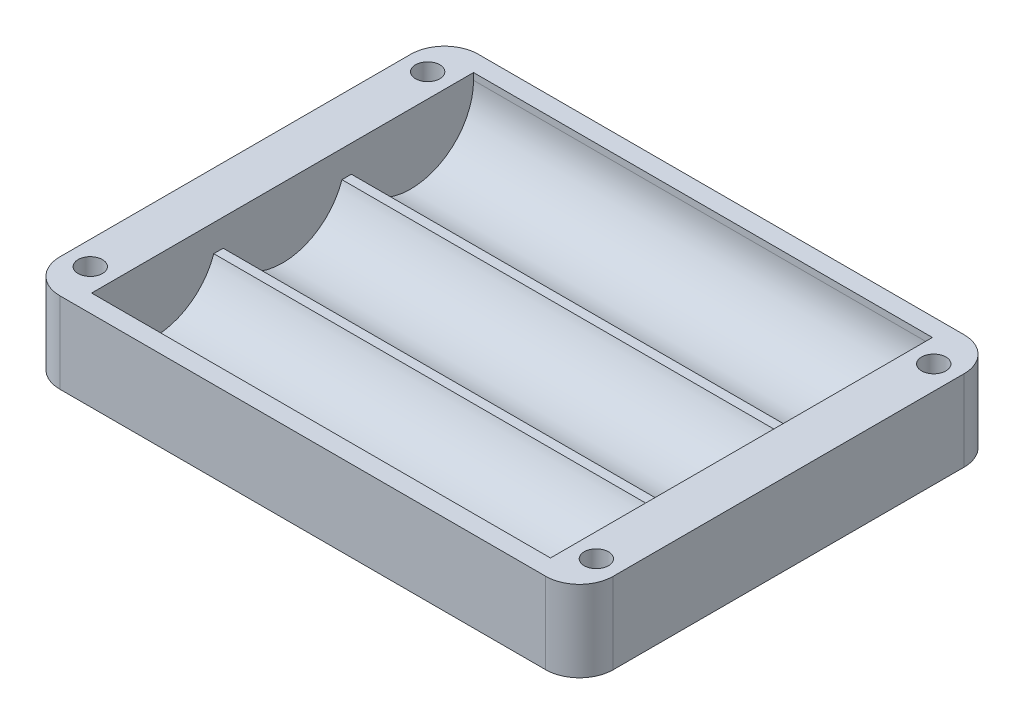
ISO-10303-21;
HEADER;
FILE_DESCRIPTION(('STEP AP214'),'2;1');
FILE_NAME('part.step','',(''),(''),'','','');
FILE_SCHEMA(('AUTOMOTIVE_DESIGN { 1 0 10303 214 1 1 1 1 }'));
ENDSEC;
DATA;
#1=APPLICATION_CONTEXT('core data for automotive mechanical design processes');
#2=APPLICATION_PROTOCOL_DEFINITION('international standard','automotive_design',2000,#1);
#3=PRODUCT_CONTEXT('',#1,'mechanical');
#4=PRODUCT('Part','Part','',(#3));
#5=PRODUCT_RELATED_PRODUCT_CATEGORY('part','',(#4));
#6=PRODUCT_DEFINITION_FORMATION('','',#4);
#7=PRODUCT_DEFINITION_CONTEXT('part definition',#1,'design');
#8=PRODUCT_DEFINITION('design','',#6,#7);
#9=PRODUCT_DEFINITION_SHAPE('','',#8);
#10=(LENGTH_UNIT() NAMED_UNIT(*) SI_UNIT(.MILLI.,.METRE.));
#11=(NAMED_UNIT(*) PLANE_ANGLE_UNIT() SI_UNIT($,.RADIAN.));
#12=(NAMED_UNIT(*) SI_UNIT($,.STERADIAN.) SOLID_ANGLE_UNIT());
#13=UNCERTAINTY_MEASURE_WITH_UNIT(LENGTH_MEASURE(1.E-05),#10,'distance_accuracy_value','');
#14=(GEOMETRIC_REPRESENTATION_CONTEXT(3) GLOBAL_UNCERTAINTY_ASSIGNED_CONTEXT((#13)) GLOBAL_UNIT_ASSIGNED_CONTEXT((#10,
#11,#12)) REPRESENTATION_CONTEXT('',''));
#15=CARTESIAN_POINT('',(0.,0.,0.));
#16=DIRECTION('',(0.,0.,1.));
#17=DIRECTION('',(1.,0.,0.));
#18=AXIS2_PLACEMENT_3D('',#15,#16,#17);
#19=CARTESIAN_POINT('',(36.,12.,26.));
#20=DIRECTION('',(0.,1.,0.));
#21=DIRECTION('',(0.,0.,1.));
#22=AXIS2_PLACEMENT_3D('',#19,#20,#21);
#23=PLANE('',#22);
#24=CARTESIAN_POINT('',(-37.5,12.,-25.));
#25=DIRECTION('',(0.,1.,0.));
#26=DIRECTION('',(0.,0.,1.));
#27=AXIS2_PLACEMENT_3D('',#24,#25,#26);
#28=CIRCLE('',#27,1.8);
#29=CARTESIAN_POINT('',(-37.5,12.,-23.2));
#30=VERTEX_POINT('',#29);
#31=EDGE_CURVE('E517',#30,#30,#28,.T.);
#32=ORIENTED_EDGE('',*,*,#31,.F.);
#33=EDGE_LOOP('',(#32));
#34=FACE_BOUND('',#33,.T.);
#35=CARTESIAN_POINT('',(-37.5,12.,25.));
#36=DIRECTION('',(0.,1.,0.));
#37=DIRECTION('',(0.,0.,1.));
#38=AXIS2_PLACEMENT_3D('',#35,#36,#37);
#39=CIRCLE('',#38,1.8);
#40=CARTESIAN_POINT('',(-37.5,12.,26.8));
#41=VERTEX_POINT('',#40);
#42=EDGE_CURVE('E519',#41,#41,#39,.T.);
#43=ORIENTED_EDGE('',*,*,#42,.F.);
#44=EDGE_LOOP('',(#43));
#45=FACE_BOUND('',#44,.T.);
#46=CARTESIAN_POINT('',(37.5,12.,25.));
#47=DIRECTION('',(0.,1.,0.));
#48=DIRECTION('',(0.,0.,1.));
#49=AXIS2_PLACEMENT_3D('',#46,#47,#48);
#50=CIRCLE('',#49,1.8);
#51=CARTESIAN_POINT('',(37.5,12.,26.8));
#52=VERTEX_POINT('',#51);
#53=EDGE_CURVE('E527',#52,#52,#50,.T.);
#54=ORIENTED_EDGE('',*,*,#53,.F.);
#55=EDGE_LOOP('',(#54));
#56=FACE_BOUND('',#55,.T.);
#57=CARTESIAN_POINT('',(37.5,12.,-25.));
#58=DIRECTION('',(0.,1.,0.));
#59=DIRECTION('',(0.,0.,1.));
#60=AXIS2_PLACEMENT_3D('',#57,#58,#59);
#61=CIRCLE('',#60,1.8);
#62=CARTESIAN_POINT('',(37.5,12.,-23.2));
#63=VERTEX_POINT('',#62);
#64=EDGE_CURVE('E533',#63,#63,#61,.T.);
#65=ORIENTED_EDGE('',*,*,#64,.F.);
#66=EDGE_LOOP('',(#65));
#67=FACE_BOUND('',#66,.T.);
#68=CARTESIAN_POINT('',(36.,12.,26.));
#69=DIRECTION('',(0.,1.,0.));
#70=DIRECTION('',(0.,0.,1.));
#71=AXIS2_PLACEMENT_3D('',#68,#69,#70);
#72=CIRCLE('',#71,5.);
#73=CARTESIAN_POINT('',(36.,12.,31.));
#74=VERTEX_POINT('',#73);
#75=CARTESIAN_POINT('',(41.,12.,26.));
#76=VERTEX_POINT('',#75);
#77=EDGE_CURVE('E158',#74,#76,#72,.T.);
#78=ORIENTED_EDGE('',*,*,#77,.T.);
#79=DIRECTION('',(0.,0.,-1.));
#80=VECTOR('',#79,1.);
#81=CARTESIAN_POINT('',(41.,12.,-26.));
#82=LINE('',#81,#80);
#83=CARTESIAN_POINT('',(41.,12.,-26.));
#84=VERTEX_POINT('',#83);
#85=EDGE_CURVE('E99',#76,#84,#82,.T.);
#86=ORIENTED_EDGE('',*,*,#85,.T.);
#87=CARTESIAN_POINT('',(36.,12.,-26.));
#88=DIRECTION('',(0.,1.,0.));
#89=DIRECTION('',(0.,0.,-1.));
#90=AXIS2_PLACEMENT_3D('',#87,#88,#89);
#91=CIRCLE('',#90,5.);
#92=CARTESIAN_POINT('',(36.,12.,-31.));
#93=VERTEX_POINT('',#92);
#94=EDGE_CURVE('E243',#84,#93,#91,.T.);
#95=ORIENTED_EDGE('',*,*,#94,.T.);
#96=DIRECTION('',(-1.,0.,0.));
#97=VECTOR('',#96,1.);
#98=CARTESIAN_POINT('',(-36.,12.,-31.));
#99=LINE('',#98,#97);
#100=CARTESIAN_POINT('',(-36.,12.,-31.));
#101=VERTEX_POINT('',#100);
#102=EDGE_CURVE('E245',#93,#101,#99,.T.);
#103=ORIENTED_EDGE('',*,*,#102,.T.);
#104=CARTESIAN_POINT('',(-36.,12.,-26.));
#105=DIRECTION('',(0.,1.,0.));
#106=DIRECTION('',(0.,0.,1.));
#107=AXIS2_PLACEMENT_3D('',#104,#105,#106);
#108=CIRCLE('',#107,5.);
#109=CARTESIAN_POINT('',(-41.,12.,-26.));
#110=VERTEX_POINT('',#109);
#111=EDGE_CURVE('E121',#101,#110,#108,.T.);
#112=ORIENTED_EDGE('',*,*,#111,.T.);
#113=DIRECTION('',(0.,0.,1.));
#114=VECTOR('',#113,1.);
#115=CARTESIAN_POINT('',(-41.,12.,-26.));
#116=LINE('',#115,#114);
#117=CARTESIAN_POINT('',(-41.,12.,26.));
#118=VERTEX_POINT('',#117);
#119=EDGE_CURVE('E114',#110,#118,#116,.T.);
#120=ORIENTED_EDGE('',*,*,#119,.T.);
#121=CARTESIAN_POINT('',(-36.,12.,26.));
#122=DIRECTION('',(0.,1.,0.));
#123=DIRECTION('',(0.,0.,1.));
#124=AXIS2_PLACEMENT_3D('',#121,#122,#123);
#125=CIRCLE('',#124,5.);
#126=CARTESIAN_POINT('',(-36.,12.,31.));
#127=VERTEX_POINT('',#126);
#128=EDGE_CURVE('E118',#118,#127,#125,.T.);
#129=ORIENTED_EDGE('',*,*,#128,.T.);
#130=DIRECTION('',(1.,0.,0.));
#131=VECTOR('',#130,1.);
#132=CARTESIAN_POINT('',(-36.,12.,31.));
#133=LINE('',#132,#131);
#134=EDGE_CURVE('E57',#127,#74,#133,.T.);
#135=ORIENTED_EDGE('',*,*,#134,.T.);
#136=EDGE_LOOP('',(#78,#86,#95,#103,#112,#120,#129,#135));
#137=FACE_BOUND('',#136,.T.);
#138=DIRECTION('',(1.,0.,0.));
#139=VECTOR('',#138,1.);
#140=CARTESIAN_POINT('',(36.,12.,28.3));
#141=LINE('',#140,#139);
#142=CARTESIAN_POINT('',(-34.,12.,28.3));
#143=VERTEX_POINT('',#142);
#144=CARTESIAN_POINT('',(34.,12.,28.3));
#145=VERTEX_POINT('',#144);
#146=EDGE_CURVE('E41',#143,#145,#141,.T.);
#147=ORIENTED_EDGE('',*,*,#146,.F.);
#148=DIRECTION('',(0.,0.,-1.));
#149=VECTOR('',#148,1.);
#150=CARTESIAN_POINT('',(-34.,12.,26.));
#151=LINE('',#150,#149);
#152=CARTESIAN_POINT('',(-34.,12.,-28.3));
#153=VERTEX_POINT('',#152);
#154=EDGE_CURVE('E11',#143,#153,#151,.T.);
#155=ORIENTED_EDGE('',*,*,#154,.T.);
#156=DIRECTION('',(-1.,0.,0.));
#157=VECTOR('',#156,1.);
#158=CARTESIAN_POINT('',(36.,12.,-28.3));
#159=LINE('',#158,#157);
#160=CARTESIAN_POINT('',(34.,12.,-28.3));
#161=VERTEX_POINT('',#160);
#162=EDGE_CURVE('E175',#161,#153,#159,.T.);
#163=ORIENTED_EDGE('',*,*,#162,.F.);
#164=DIRECTION('',(0.,0.,-1.));
#165=VECTOR('',#164,1.);
#166=CARTESIAN_POINT('',(34.,12.,26.));
#167=LINE('',#166,#165);
#168=EDGE_CURVE('E173',#145,#161,#167,.T.);
#169=ORIENTED_EDGE('',*,*,#168,.F.);
#170=EDGE_LOOP('',(#147,#155,#163,#169));
#171=FACE_BOUND('',#170,.T.);
#172=ADVANCED_FACE('F33',(#34,#45,#56,#67,#137,#171),#23,.T.);
#173=CARTESIAN_POINT('',(36.,12.,26.));
#174=DIRECTION('',(0.,-1.,0.));
#175=DIRECTION('',(0.,0.,-1.));
#176=AXIS2_PLACEMENT_3D('',#173,#174,#175);
#177=CYLINDRICAL_SURFACE('',#176,5.);
#178=CARTESIAN_POINT('',(36.,0.,26.));
#179=DIRECTION('',(0.,1.,0.));
#180=DIRECTION('',(0.,0.,1.));
#181=AXIS2_PLACEMENT_3D('',#178,#179,#180);
#182=CIRCLE('',#181,5.);
#183=CARTESIAN_POINT('',(36.,0.,31.));
#184=VERTEX_POINT('',#183);
#185=CARTESIAN_POINT('',(41.,0.,26.));
#186=VERTEX_POINT('',#185);
#187=EDGE_CURVE('E142',#184,#186,#182,.T.);
#188=ORIENTED_EDGE('',*,*,#187,.T.);
#189=DIRECTION('',(0.,-1.,0.));
#190=VECTOR('',#189,1.);
#191=CARTESIAN_POINT('',(41.,12.,26.));
#192=LINE('',#191,#190);
#193=EDGE_CURVE('E171',#76,#186,#192,.T.);
#194=ORIENTED_EDGE('',*,*,#193,.F.);
#195=ORIENTED_EDGE('',*,*,#77,.F.);
#196=DIRECTION('',(0.,-1.,0.));
#197=VECTOR('',#196,1.);
#198=CARTESIAN_POINT('',(36.,12.,31.));
#199=LINE('',#198,#197);
#200=EDGE_CURVE('E138',#74,#184,#199,.T.);
#201=ORIENTED_EDGE('',*,*,#200,.T.);
#202=EDGE_LOOP('',(#188,#194,#195,#201));
#203=FACE_BOUND('',#202,.T.);
#204=ADVANCED_FACE('F35',(#203),#177,.T.);
#205=CARTESIAN_POINT('',(41.,12.,-26.));
#206=DIRECTION('',(-1.,0.,0.));
#207=DIRECTION('',(0.,0.,1.));
#208=AXIS2_PLACEMENT_3D('',#205,#206,#207);
#209=PLANE('',#208);
#210=DIRECTION('',(0.,0.,-1.));
#211=VECTOR('',#210,1.);
#212=CARTESIAN_POINT('',(41.,0.,-26.));
#213=LINE('',#212,#211);
#214=CARTESIAN_POINT('',(41.,0.,-26.));
#215=VERTEX_POINT('',#214);
#216=EDGE_CURVE('E145',#186,#215,#213,.T.);
#217=ORIENTED_EDGE('',*,*,#216,.T.);
#218=DIRECTION('',(0.,-1.,0.));
#219=VECTOR('',#218,1.);
#220=CARTESIAN_POINT('',(41.,12.,-26.));
#221=LINE('',#220,#219);
#222=EDGE_CURVE('E168',#84,#215,#221,.T.);
#223=ORIENTED_EDGE('',*,*,#222,.F.);
#224=ORIENTED_EDGE('',*,*,#85,.F.);
#225=ORIENTED_EDGE('',*,*,#193,.T.);
#226=EDGE_LOOP('',(#217,#223,#224,#225));
#227=FACE_BOUND('',#226,.T.);
#228=ADVANCED_FACE('F263',(#227),#209,.F.);
#229=CARTESIAN_POINT('',(36.,12.,-26.));
#230=DIRECTION('',(0.,-1.,0.));
#231=DIRECTION('',(0.,0.,-1.));
#232=AXIS2_PLACEMENT_3D('',#229,#230,#231);
#233=CYLINDRICAL_SURFACE('',#232,5.);
#234=CARTESIAN_POINT('',(36.,0.,-26.));
#235=DIRECTION('',(0.,1.,0.));
#236=DIRECTION('',(0.,0.,-1.));
#237=AXIS2_PLACEMENT_3D('',#234,#235,#236);
#238=CIRCLE('',#237,5.);
#239=CARTESIAN_POINT('',(36.,0.,-31.));
#240=VERTEX_POINT('',#239);
#241=EDGE_CURVE('E148',#215,#240,#238,.T.);
#242=ORIENTED_EDGE('',*,*,#241,.T.);
#243=DIRECTION('',(0.,-1.,0.));
#244=VECTOR('',#243,1.);
#245=CARTESIAN_POINT('',(36.,12.,-31.));
#246=LINE('',#245,#244);
#247=EDGE_CURVE('E165',#93,#240,#246,.T.);
#248=ORIENTED_EDGE('',*,*,#247,.F.);
#249=ORIENTED_EDGE('',*,*,#94,.F.);
#250=ORIENTED_EDGE('',*,*,#222,.T.);
#251=EDGE_LOOP('',(#242,#248,#249,#250));
#252=FACE_BOUND('',#251,.T.);
#253=ADVANCED_FACE('F266',(#252),#233,.T.);
#254=CARTESIAN_POINT('',(-36.,12.,-31.));
#255=DIRECTION('',(0.,0.,1.));
#256=DIRECTION('',(1.,0.,0.));
#257=AXIS2_PLACEMENT_3D('',#254,#255,#256);
#258=PLANE('',#257);
#259=DIRECTION('',(-1.,0.,0.));
#260=VECTOR('',#259,1.);
#261=CARTESIAN_POINT('',(-36.,0.,-31.));
#262=LINE('',#261,#260);
#263=CARTESIAN_POINT('',(-36.,0.,-31.));
#264=VERTEX_POINT('',#263);
#265=EDGE_CURVE('E150',#240,#264,#262,.T.);
#266=ORIENTED_EDGE('',*,*,#265,.T.);
#267=DIRECTION('',(0.,-1.,0.));
#268=VECTOR('',#267,1.);
#269=CARTESIAN_POINT('',(-36.,12.,-31.));
#270=LINE('',#269,#268);
#271=EDGE_CURVE('E162',#101,#264,#270,.T.);
#272=ORIENTED_EDGE('',*,*,#271,.F.);
#273=ORIENTED_EDGE('',*,*,#102,.F.);
#274=ORIENTED_EDGE('',*,*,#247,.T.);
#275=EDGE_LOOP('',(#266,#272,#273,#274));
#276=FACE_BOUND('',#275,.T.);
#277=ADVANCED_FACE('F251',(#276),#258,.F.);
#278=CARTESIAN_POINT('',(-36.,12.,-26.));
#279=DIRECTION('',(0.,-1.,0.));
#280=DIRECTION('',(0.,0.,-1.));
#281=AXIS2_PLACEMENT_3D('',#278,#279,#280);
#282=CYLINDRICAL_SURFACE('',#281,5.);
#283=CARTESIAN_POINT('',(-36.,0.,-26.));
#284=DIRECTION('',(0.,1.,0.));
#285=DIRECTION('',(0.,0.,1.));
#286=AXIS2_PLACEMENT_3D('',#283,#284,#285);
#287=CIRCLE('',#286,5.);
#288=CARTESIAN_POINT('',(-41.,0.,-26.));
#289=VERTEX_POINT('',#288);
#290=EDGE_CURVE('E152',#264,#289,#287,.T.);
#291=ORIENTED_EDGE('',*,*,#290,.T.);
#292=DIRECTION('',(0.,-1.,0.));
#293=VECTOR('',#292,1.);
#294=CARTESIAN_POINT('',(-41.,12.,-26.));
#295=LINE('',#294,#293);
#296=EDGE_CURVE('E133',#110,#289,#295,.T.);
#297=ORIENTED_EDGE('',*,*,#296,.F.);
#298=ORIENTED_EDGE('',*,*,#111,.F.);
#299=ORIENTED_EDGE('',*,*,#271,.T.);
#300=EDGE_LOOP('',(#291,#297,#298,#299));
#301=FACE_BOUND('',#300,.T.);
#302=ADVANCED_FACE('F255',(#301),#282,.T.);
#303=CARTESIAN_POINT('',(-41.,12.,-26.));
#304=DIRECTION('',(1.,0.,0.));
#305=DIRECTION('',(0.,0.,-1.));
#306=AXIS2_PLACEMENT_3D('',#303,#304,#305);
#307=PLANE('',#306);
#308=DIRECTION('',(0.,0.,1.));
#309=VECTOR('',#308,1.);
#310=CARTESIAN_POINT('',(-41.,0.,-26.));
#311=LINE('',#310,#309);
#312=CARTESIAN_POINT('',(-41.,0.,26.));
#313=VERTEX_POINT('',#312);
#314=EDGE_CURVE('E130',#289,#313,#311,.T.);
#315=ORIENTED_EDGE('',*,*,#314,.T.);
#316=DIRECTION('',(0.,-1.,0.));
#317=VECTOR('',#316,1.);
#318=CARTESIAN_POINT('',(-41.,12.,26.));
#319=LINE('',#318,#317);
#320=EDGE_CURVE('E127',#118,#313,#319,.T.);
#321=ORIENTED_EDGE('',*,*,#320,.F.);
#322=ORIENTED_EDGE('',*,*,#119,.F.);
#323=ORIENTED_EDGE('',*,*,#296,.T.);
#324=EDGE_LOOP('',(#315,#321,#322,#323));
#325=FACE_BOUND('',#324,.T.);
#326=ADVANCED_FACE('F128',(#325),#307,.F.);
#327=CARTESIAN_POINT('',(-36.,12.,26.));
#328=DIRECTION('',(0.,-1.,0.));
#329=DIRECTION('',(0.,0.,-1.));
#330=AXIS2_PLACEMENT_3D('',#327,#328,#329);
#331=CYLINDRICAL_SURFACE('',#330,5.);
#332=CARTESIAN_POINT('',(-36.,0.,26.));
#333=DIRECTION('',(0.,1.,0.));
#334=DIRECTION('',(0.,0.,1.));
#335=AXIS2_PLACEMENT_3D('',#332,#333,#334);
#336=CIRCLE('',#335,5.);
#337=CARTESIAN_POINT('',(-36.,0.,31.));
#338=VERTEX_POINT('',#337);
#339=EDGE_CURVE('E155',#313,#338,#336,.T.);
#340=ORIENTED_EDGE('',*,*,#339,.T.);
#341=DIRECTION('',(0.,-1.,0.));
#342=VECTOR('',#341,1.);
#343=CARTESIAN_POINT('',(-36.,12.,31.));
#344=LINE('',#343,#342);
#345=EDGE_CURVE('E134',#127,#338,#344,.T.);
#346=ORIENTED_EDGE('',*,*,#345,.F.);
#347=ORIENTED_EDGE('',*,*,#128,.F.);
#348=ORIENTED_EDGE('',*,*,#320,.T.);
#349=EDGE_LOOP('',(#340,#346,#347,#348));
#350=FACE_BOUND('',#349,.T.);
#351=ADVANCED_FACE('F136',(#350),#331,.T.);
#352=CARTESIAN_POINT('',(-36.,12.,31.));
#353=DIRECTION('',(0.,0.,-1.));
#354=DIRECTION('',(-1.,0.,0.));
#355=AXIS2_PLACEMENT_3D('',#352,#353,#354);
#356=PLANE('',#355);
#357=DIRECTION('',(1.,0.,0.));
#358=VECTOR('',#357,1.);
#359=CARTESIAN_POINT('',(-36.,0.,31.));
#360=LINE('',#359,#358);
#361=EDGE_CURVE('E90',#338,#184,#360,.T.);
#362=ORIENTED_EDGE('',*,*,#361,.T.);
#363=ORIENTED_EDGE('',*,*,#200,.F.);
#364=ORIENTED_EDGE('',*,*,#134,.F.);
#365=ORIENTED_EDGE('',*,*,#345,.T.);
#366=EDGE_LOOP('',(#362,#363,#364,#365));
#367=FACE_BOUND('',#366,.T.);
#368=ADVANCED_FACE('F259',(#367),#356,.F.);
#369=CARTESIAN_POINT('',(36.,0.,26.));
#370=DIRECTION('',(0.,1.,0.));
#371=DIRECTION('',(0.,0.,1.));
#372=AXIS2_PLACEMENT_3D('',#369,#370,#371);
#373=PLANE('',#372);
#374=ORIENTED_EDGE('',*,*,#187,.F.);
#375=ORIENTED_EDGE('',*,*,#361,.F.);
#376=ORIENTED_EDGE('',*,*,#339,.F.);
#377=ORIENTED_EDGE('',*,*,#314,.F.);
#378=ORIENTED_EDGE('',*,*,#290,.F.);
#379=ORIENTED_EDGE('',*,*,#265,.F.);
#380=ORIENTED_EDGE('',*,*,#241,.F.);
#381=ORIENTED_EDGE('',*,*,#216,.F.);
#382=EDGE_LOOP('',(#374,#375,#376,#377,#378,#379,#380,#381));
#383=FACE_BOUND('',#382,.T.);
#384=ADVANCED_FACE('F258',(#383),#373,.F.);
#385=CARTESIAN_POINT('',(-34.,11.,-19.));
#386=DIRECTION('',(1.,0.,0.));
#387=DIRECTION('',(0.,0.,-1.));
#388=AXIS2_PLACEMENT_3D('',#385,#386,#387);
#389=CYLINDRICAL_SURFACE('',#388,9.3);
#390=CARTESIAN_POINT('',(34.,11.,-19.));
#391=DIRECTION('',(1.,0.,0.));
#392=DIRECTION('',(0.,0.,-1.));
#393=AXIS2_PLACEMENT_3D('',#390,#391,#392);
#394=CIRCLE('',#393,9.3);
#395=CARTESIAN_POINT('',(34.,8.,-10.1971595493273));
#396=VERTEX_POINT('',#395);
#397=CARTESIAN_POINT('',(34.,11.,-28.3));
#398=VERTEX_POINT('',#397);
#399=EDGE_CURVE('E206',#396,#398,#394,.T.);
#400=ORIENTED_EDGE('',*,*,#399,.T.);
#401=DIRECTION('',(1.,0.,0.));
#402=VECTOR('',#401,1.);
#403=CARTESIAN_POINT('',(-34.,11.,-28.3));
#404=LINE('',#403,#402);
#405=CARTESIAN_POINT('',(-34.,11.,-28.3));
#406=VERTEX_POINT('',#405);
#407=EDGE_CURVE('E205',#406,#398,#404,.T.);
#408=ORIENTED_EDGE('',*,*,#407,.F.);
#409=CARTESIAN_POINT('',(-34.,11.,-19.));
#410=DIRECTION('',(1.,0.,0.));
#411=DIRECTION('',(0.,0.,-1.));
#412=AXIS2_PLACEMENT_3D('',#409,#410,#411);
#413=CIRCLE('',#412,9.3);
#414=CARTESIAN_POINT('',(-34.,8.,-10.1971595493273));
#415=VERTEX_POINT('',#414);
#416=EDGE_CURVE('E225',#415,#406,#413,.T.);
#417=ORIENTED_EDGE('',*,*,#416,.F.);
#418=DIRECTION('',(1.,0.,0.));
#419=VECTOR('',#418,1.);
#420=CARTESIAN_POINT('',(-34.,8.,-10.1971595493273));
#421=LINE('',#420,#419);
#422=EDGE_CURVE('E146',#415,#396,#421,.T.);
#423=ORIENTED_EDGE('',*,*,#422,.T.);
#424=EDGE_LOOP('',(#400,#408,#417,#423));
#425=FACE_BOUND('',#424,.T.);
#426=ADVANCED_FACE('F284',(#425),#389,.F.);
#427=CARTESIAN_POINT('',(-34.,8.,-8.80284045067273));
#428=DIRECTION('',(0.,-1.,0.));
#429=DIRECTION('',(0.,0.,-1.));
#430=AXIS2_PLACEMENT_3D('',#427,#428,#429);
#431=PLANE('',#430);
#432=DIRECTION('',(0.,0.,-1.));
#433=VECTOR('',#432,1.);
#434=CARTESIAN_POINT('',(34.,8.,-8.80284045067273));
#435=LINE('',#434,#433);
#436=CARTESIAN_POINT('',(34.,8.,-8.80284045067273));
#437=VERTEX_POINT('',#436);
#438=EDGE_CURVE('E222',#437,#396,#435,.T.);
#439=ORIENTED_EDGE('',*,*,#438,.T.);
#440=ORIENTED_EDGE('',*,*,#422,.F.);
#441=DIRECTION('',(0.,0.,-1.));
#442=VECTOR('',#441,1.);
#443=CARTESIAN_POINT('',(-34.,8.,-8.80284045067273));
#444=LINE('',#443,#442);
#445=CARTESIAN_POINT('',(-34.,8.,-8.80284045067273));
#446=VERTEX_POINT('',#445);
#447=EDGE_CURVE('E240',#446,#415,#444,.T.);
#448=ORIENTED_EDGE('',*,*,#447,.F.);
#449=DIRECTION('',(1.,0.,0.));
#450=VECTOR('',#449,1.);
#451=CARTESIAN_POINT('',(-34.,8.,-8.80284045067273));
#452=LINE('',#451,#450);
#453=EDGE_CURVE('E228',#446,#437,#452,.T.);
#454=ORIENTED_EDGE('',*,*,#453,.T.);
#455=EDGE_LOOP('',(#439,#440,#448,#454));
#456=FACE_BOUND('',#455,.T.);
#457=ADVANCED_FACE('F321',(#456),#431,.F.);
#458=CARTESIAN_POINT('',(-34.,11.,0.));
#459=DIRECTION('',(1.,0.,0.));
#460=DIRECTION('',(0.,0.,-1.));
#461=AXIS2_PLACEMENT_3D('',#458,#459,#460);
#462=CYLINDRICAL_SURFACE('',#461,9.3);
#463=CARTESIAN_POINT('',(34.,11.,0.));
#464=DIRECTION('',(1.,0.,0.));
#465=DIRECTION('',(0.,0.,-1.));
#466=AXIS2_PLACEMENT_3D('',#463,#464,#465);
#467=CIRCLE('',#466,9.3);
#468=CARTESIAN_POINT('',(34.,8.,8.80284045067273));
#469=VERTEX_POINT('',#468);
#470=EDGE_CURVE('E219',#469,#437,#467,.T.);
#471=ORIENTED_EDGE('',*,*,#470,.T.);
#472=ORIENTED_EDGE('',*,*,#453,.F.);
#473=CARTESIAN_POINT('',(-34.,11.,0.));
#474=DIRECTION('',(1.,0.,0.));
#475=DIRECTION('',(0.,0.,-1.));
#476=AXIS2_PLACEMENT_3D('',#473,#474,#475);
#477=CIRCLE('',#476,9.3);
#478=CARTESIAN_POINT('',(-34.,8.,8.80284045067273));
#479=VERTEX_POINT('',#478);
#480=EDGE_CURVE('E549',#479,#446,#477,.T.);
#481=ORIENTED_EDGE('',*,*,#480,.F.);
#482=DIRECTION('',(1.,0.,0.));
#483=VECTOR('',#482,1.);
#484=CARTESIAN_POINT('',(-34.,8.,8.80284045067273));
#485=LINE('',#484,#483);
#486=EDGE_CURVE('E231',#479,#469,#485,.T.);
#487=ORIENTED_EDGE('',*,*,#486,.T.);
#488=EDGE_LOOP('',(#471,#472,#481,#487));
#489=FACE_BOUND('',#488,.T.);
#490=ADVANCED_FACE('F328',(#489),#462,.F.);
#491=CARTESIAN_POINT('',(-34.,8.,10.1971595493273));
#492=DIRECTION('',(0.,-1.,0.));
#493=DIRECTION('',(0.,0.,-1.));
#494=AXIS2_PLACEMENT_3D('',#491,#492,#493);
#495=PLANE('',#494);
#496=DIRECTION('',(0.,0.,-1.));
#497=VECTOR('',#496,1.);
#498=CARTESIAN_POINT('',(34.,8.,10.1971595493273));
#499=LINE('',#498,#497);
#500=CARTESIAN_POINT('',(34.,8.,10.1971595493273));
#501=VERTEX_POINT('',#500);
#502=EDGE_CURVE('E216',#501,#469,#499,.T.);
#503=ORIENTED_EDGE('',*,*,#502,.T.);
#504=ORIENTED_EDGE('',*,*,#486,.F.);
#505=DIRECTION('',(0.,0.,-1.));
#506=VECTOR('',#505,1.);
#507=CARTESIAN_POINT('',(-34.,8.,10.1971595493273));
#508=LINE('',#507,#506);
#509=CARTESIAN_POINT('',(-34.,8.,10.1971595493273));
#510=VERTEX_POINT('',#509);
#511=EDGE_CURVE('E546',#510,#479,#508,.T.);
#512=ORIENTED_EDGE('',*,*,#511,.F.);
#513=DIRECTION('',(1.,0.,0.));
#514=VECTOR('',#513,1.);
#515=CARTESIAN_POINT('',(-34.,8.,10.1971595493273));
#516=LINE('',#515,#514);
#517=EDGE_CURVE('E234',#510,#501,#516,.T.);
#518=ORIENTED_EDGE('',*,*,#517,.T.);
#519=EDGE_LOOP('',(#503,#504,#512,#518));
#520=FACE_BOUND('',#519,.T.);
#521=ADVANCED_FACE('F336',(#520),#495,.F.);
#522=CARTESIAN_POINT('',(-34.,11.,19.));
#523=DIRECTION('',(1.,0.,0.));
#524=DIRECTION('',(0.,0.,-1.));
#525=AXIS2_PLACEMENT_3D('',#522,#523,#524);
#526=CYLINDRICAL_SURFACE('',#525,9.3);
#527=CARTESIAN_POINT('',(34.,11.,19.));
#528=DIRECTION('',(1.,0.,0.));
#529=DIRECTION('',(0.,0.,-1.));
#530=AXIS2_PLACEMENT_3D('',#527,#528,#529);
#531=CIRCLE('',#530,9.3);
#532=CARTESIAN_POINT('',(34.,11.,28.3));
#533=VERTEX_POINT('',#532);
#534=EDGE_CURVE('E208',#533,#501,#531,.T.);
#535=ORIENTED_EDGE('',*,*,#534,.T.);
#536=ORIENTED_EDGE('',*,*,#517,.F.);
#537=CARTESIAN_POINT('',(-34.,11.,19.));
#538=DIRECTION('',(1.,0.,0.));
#539=DIRECTION('',(0.,0.,-1.));
#540=AXIS2_PLACEMENT_3D('',#537,#538,#539);
#541=CIRCLE('',#540,9.3);
#542=CARTESIAN_POINT('',(-34.,11.,28.3));
#543=VERTEX_POINT('',#542);
#544=EDGE_CURVE('E543',#543,#510,#541,.T.);
#545=ORIENTED_EDGE('',*,*,#544,.F.);
#546=DIRECTION('',(1.,0.,0.));
#547=VECTOR('',#546,1.);
#548=CARTESIAN_POINT('',(-34.,11.,28.3));
#549=LINE('',#548,#547);
#550=EDGE_CURVE('E237',#543,#533,#549,.T.);
#551=ORIENTED_EDGE('',*,*,#550,.T.);
#552=EDGE_LOOP('',(#535,#536,#545,#551));
#553=FACE_BOUND('',#552,.T.);
#554=ADVANCED_FACE('F344',(#553),#526,.F.);
#555=CARTESIAN_POINT('',(-34.,11.,28.3));
#556=DIRECTION('',(0.,0.,1.));
#557=DIRECTION('',(1.,0.,0.));
#558=AXIS2_PLACEMENT_3D('',#555,#556,#557);
#559=PLANE('',#558);
#560=ORIENTED_EDGE('',*,*,#146,.T.);
#561=DIRECTION('',(0.,-1.,0.));
#562=VECTOR('',#561,1.);
#563=CARTESIAN_POINT('',(34.,11.,28.3));
#564=LINE('',#563,#562);
#565=EDGE_CURVE('E48',#145,#533,#564,.T.);
#566=ORIENTED_EDGE('',*,*,#565,.T.);
#567=ORIENTED_EDGE('',*,*,#550,.F.);
#568=DIRECTION('',(0.,-1.,0.));
#569=VECTOR('',#568,1.);
#570=CARTESIAN_POINT('',(-34.,11.,28.3));
#571=LINE('',#570,#569);
#572=EDGE_CURVE('E187',#143,#543,#571,.T.);
#573=ORIENTED_EDGE('',*,*,#572,.F.);
#574=EDGE_LOOP('',(#560,#566,#567,#573));
#575=FACE_BOUND('',#574,.T.);
#576=ADVANCED_FACE('F181',(#575),#559,.F.);
#577=CARTESIAN_POINT('',(-34.,17.8663906625634,-28.3));
#578=DIRECTION('',(0.,0.,-1.));
#579=DIRECTION('',(-1.,0.,0.));
#580=AXIS2_PLACEMENT_3D('',#577,#578,#579);
#581=PLANE('',#580);
#582=ORIENTED_EDGE('',*,*,#162,.T.);
#583=DIRECTION('',(0.,1.,0.));
#584=VECTOR('',#583,1.);
#585=CARTESIAN_POINT('',(-34.,17.8663906625634,-28.3));
#586=LINE('',#585,#584);
#587=EDGE_CURVE('E540',#406,#153,#586,.T.);
#588=ORIENTED_EDGE('',*,*,#587,.F.);
#589=ORIENTED_EDGE('',*,*,#407,.T.);
#590=DIRECTION('',(0.,1.,0.));
#591=VECTOR('',#590,1.);
#592=CARTESIAN_POINT('',(34.,17.8663906625634,-28.3));
#593=LINE('',#592,#591);
#594=EDGE_CURVE('E195',#398,#161,#593,.T.);
#595=ORIENTED_EDGE('',*,*,#594,.T.);
#596=EDGE_LOOP('',(#582,#588,#589,#595));
#597=FACE_BOUND('',#596,.T.);
#598=ADVANCED_FACE('F201',(#597),#581,.F.);
#599=CARTESIAN_POINT('',(-34.,11.,-19.));
#600=DIRECTION('',(1.,0.,0.));
#601=DIRECTION('',(0.,0.,-1.));
#602=AXIS2_PLACEMENT_3D('',#599,#600,#601);
#603=PLANE('',#602);
#604=ORIENTED_EDGE('',*,*,#572,.T.);
#605=ORIENTED_EDGE('',*,*,#544,.T.);
#606=ORIENTED_EDGE('',*,*,#511,.T.);
#607=ORIENTED_EDGE('',*,*,#480,.T.);
#608=ORIENTED_EDGE('',*,*,#447,.T.);
#609=ORIENTED_EDGE('',*,*,#416,.T.);
#610=ORIENTED_EDGE('',*,*,#587,.T.);
#611=ORIENTED_EDGE('',*,*,#154,.F.);
#612=EDGE_LOOP('',(#604,#605,#606,#607,#608,#609,#610,#611));
#613=FACE_BOUND('',#612,.T.);
#614=ADVANCED_FACE('F365',(#613),#603,.T.);
#615=CARTESIAN_POINT('',(34.,11.,-19.));
#616=DIRECTION('',(1.,0.,0.));
#617=DIRECTION('',(0.,0.,-1.));
#618=AXIS2_PLACEMENT_3D('',#615,#616,#617);
#619=PLANE('',#618);
#620=ORIENTED_EDGE('',*,*,#168,.T.);
#621=ORIENTED_EDGE('',*,*,#594,.F.);
#622=ORIENTED_EDGE('',*,*,#399,.F.);
#623=ORIENTED_EDGE('',*,*,#438,.F.);
#624=ORIENTED_EDGE('',*,*,#470,.F.);
#625=ORIENTED_EDGE('',*,*,#502,.F.);
#626=ORIENTED_EDGE('',*,*,#534,.F.);
#627=ORIENTED_EDGE('',*,*,#565,.F.);
#628=EDGE_LOOP('',(#620,#621,#622,#623,#624,#625,#626,#627));
#629=FACE_BOUND('',#628,.T.);
#630=ADVANCED_FACE('F192',(#629),#619,.F.);
#631=CARTESIAN_POINT('',(37.5,2.,-25.));
#632=DIRECTION('',(0.,1.,0.));
#633=DIRECTION('',(0.,0.,1.));
#634=AXIS2_PLACEMENT_3D('',#631,#632,#633);
#635=CONICAL_SURFACE('',#634,1.8,1.02974425867665);
#636=CARTESIAN_POINT('',(37.5,0.918450885750393,-25.));
#637=VERTEX_POINT('',#636);
#638=VERTEX_LOOP('',#637);
#639=FACE_BOUND('',#638,.T.);
#640=CARTESIAN_POINT('',(37.5,2.,-25.));
#641=DIRECTION('',(0.,1.,0.));
#642=DIRECTION('',(0.,0.,1.));
#643=AXIS2_PLACEMENT_3D('',#640,#641,#642);
#644=CIRCLE('',#643,1.8);
#645=CARTESIAN_POINT('',(37.5,2.,-23.2));
#646=VERTEX_POINT('',#645);
#647=EDGE_CURVE('E210',#646,#646,#644,.T.);
#648=ORIENTED_EDGE('',*,*,#647,.T.);
#649=EDGE_LOOP('',(#648));
#650=FACE_BOUND('',#649,.T.);
#651=ADVANCED_FACE('F378',(#639,#650),#635,.F.);
#652=CARTESIAN_POINT('',(37.5,12.,-25.));
#653=DIRECTION('',(0.,1.,0.));
#654=DIRECTION('',(0.,0.,1.));
#655=AXIS2_PLACEMENT_3D('',#652,#653,#654);
#656=CYLINDRICAL_SURFACE('',#655,1.8);
#657=ORIENTED_EDGE('',*,*,#647,.F.);
#658=EDGE_LOOP('',(#657));
#659=FACE_BOUND('',#658,.T.);
#660=ORIENTED_EDGE('',*,*,#64,.T.);
#661=EDGE_LOOP('',(#660));
#662=FACE_BOUND('',#661,.T.);
#663=ADVANCED_FACE('F385',(#659,#662),#656,.F.);
#664=CARTESIAN_POINT('',(37.5,2.,25.));
#665=DIRECTION('',(0.,1.,0.));
#666=DIRECTION('',(0.,0.,1.));
#667=AXIS2_PLACEMENT_3D('',#664,#665,#666);
#668=CONICAL_SURFACE('',#667,1.8,1.02974425867665);
#669=CARTESIAN_POINT('',(37.5,0.918450885750393,25.));
#670=VERTEX_POINT('',#669);
#671=VERTEX_LOOP('',#670);
#672=FACE_BOUND('',#671,.T.);
#673=CARTESIAN_POINT('',(37.5,2.,25.));
#674=DIRECTION('',(0.,1.,0.));
#675=DIRECTION('',(0.,0.,1.));
#676=AXIS2_PLACEMENT_3D('',#673,#674,#675);
#677=CIRCLE('',#676,1.8);
#678=CARTESIAN_POINT('',(37.5,2.,26.8));
#679=VERTEX_POINT('',#678);
#680=EDGE_CURVE('E530',#679,#679,#677,.T.);
#681=ORIENTED_EDGE('',*,*,#680,.T.);
#682=EDGE_LOOP('',(#681));
#683=FACE_BOUND('',#682,.T.);
#684=ADVANCED_FACE('F393',(#672,#683),#668,.F.);
#685=CARTESIAN_POINT('',(37.5,12.,25.));
#686=DIRECTION('',(0.,1.,0.));
#687=DIRECTION('',(0.,0.,1.));
#688=AXIS2_PLACEMENT_3D('',#685,#686,#687);
#689=CYLINDRICAL_SURFACE('',#688,1.8);
#690=ORIENTED_EDGE('',*,*,#680,.F.);
#691=EDGE_LOOP('',(#690));
#692=FACE_BOUND('',#691,.T.);
#693=ORIENTED_EDGE('',*,*,#53,.T.);
#694=EDGE_LOOP('',(#693));
#695=FACE_BOUND('',#694,.T.);
#696=ADVANCED_FACE('F401',(#692,#695),#689,.F.);
#697=CARTESIAN_POINT('',(-37.5,2.,25.));
#698=DIRECTION('',(0.,1.,0.));
#699=DIRECTION('',(0.,0.,1.));
#700=AXIS2_PLACEMENT_3D('',#697,#698,#699);
#701=CONICAL_SURFACE('',#700,1.8,1.02974425867665);
#702=CARTESIAN_POINT('',(-37.5,0.918450885750393,25.));
#703=VERTEX_POINT('',#702);
#704=VERTEX_LOOP('',#703);
#705=FACE_BOUND('',#704,.T.);
#706=CARTESIAN_POINT('',(-37.5,2.,25.));
#707=DIRECTION('',(0.,1.,0.));
#708=DIRECTION('',(0.,0.,1.));
#709=AXIS2_PLACEMENT_3D('',#706,#707,#708);
#710=CIRCLE('',#709,1.8);
#711=CARTESIAN_POINT('',(-37.5,2.,26.8));
#712=VERTEX_POINT('',#711);
#713=EDGE_CURVE('E524',#712,#712,#710,.T.);
#714=ORIENTED_EDGE('',*,*,#713,.T.);
#715=EDGE_LOOP('',(#714));
#716=FACE_BOUND('',#715,.T.);
#717=ADVANCED_FACE('F409',(#705,#716),#701,.F.);
#718=CARTESIAN_POINT('',(-37.5,12.,25.));
#719=DIRECTION('',(0.,1.,0.));
#720=DIRECTION('',(0.,0.,1.));
#721=AXIS2_PLACEMENT_3D('',#718,#719,#720);
#722=CYLINDRICAL_SURFACE('',#721,1.8);
#723=ORIENTED_EDGE('',*,*,#713,.F.);
#724=EDGE_LOOP('',(#723));
#725=FACE_BOUND('',#724,.T.);
#726=ORIENTED_EDGE('',*,*,#42,.T.);
#727=EDGE_LOOP('',(#726));
#728=FACE_BOUND('',#727,.T.);
#729=ADVANCED_FACE('F417',(#725,#728),#722,.F.);
#730=CARTESIAN_POINT('',(-37.5,2.,-25.));
#731=DIRECTION('',(0.,1.,0.));
#732=DIRECTION('',(0.,0.,1.));
#733=AXIS2_PLACEMENT_3D('',#730,#731,#732);
#734=CONICAL_SURFACE('',#733,1.8,1.02974425867665);
#735=CARTESIAN_POINT('',(-37.5,0.918450885750393,-25.));
#736=VERTEX_POINT('',#735);
#737=VERTEX_LOOP('',#736);
#738=FACE_BOUND('',#737,.T.);
#739=CARTESIAN_POINT('',(-37.5,2.,-25.));
#740=DIRECTION('',(0.,1.,0.));
#741=DIRECTION('',(0.,0.,1.));
#742=AXIS2_PLACEMENT_3D('',#739,#740,#741);
#743=CIRCLE('',#742,1.8);
#744=CARTESIAN_POINT('',(-37.5,2.,-23.2));
#745=VERTEX_POINT('',#744);
#746=EDGE_CURVE('E515',#745,#745,#743,.T.);
#747=ORIENTED_EDGE('',*,*,#746,.T.);
#748=EDGE_LOOP('',(#747));
#749=FACE_BOUND('',#748,.T.);
#750=ADVANCED_FACE('F425',(#738,#749),#734,.F.);
#751=CARTESIAN_POINT('',(-37.5,12.,-25.));
#752=DIRECTION('',(0.,1.,0.));
#753=DIRECTION('',(0.,0.,1.));
#754=AXIS2_PLACEMENT_3D('',#751,#752,#753);
#755=CYLINDRICAL_SURFACE('',#754,1.8);
#756=ORIENTED_EDGE('',*,*,#746,.F.);
#757=EDGE_LOOP('',(#756));
#758=FACE_BOUND('',#757,.T.);
#759=ORIENTED_EDGE('',*,*,#31,.T.);
#760=EDGE_LOOP('',(#759));
#761=FACE_BOUND('',#760,.T.);
#762=ADVANCED_FACE('F433',(#758,#761),#755,.F.);
#763=CLOSED_SHELL('',(#172,#204,#228,#253,#277,#302,#326,#351,#368,#384,#426,#457,#490,#521,
#554,#576,#598,#614,#630,#651,#663,#684,#696,#717,#729,#750,#762));
#764=MANIFOLD_SOLID_BREP('B2',#763);
#765=ADVANCED_BREP_SHAPE_REPRESENTATION('',(#18,#764),#14);
#766=SHAPE_DEFINITION_REPRESENTATION(#9,#765);
ENDSEC;
END-ISO-10303-21;
